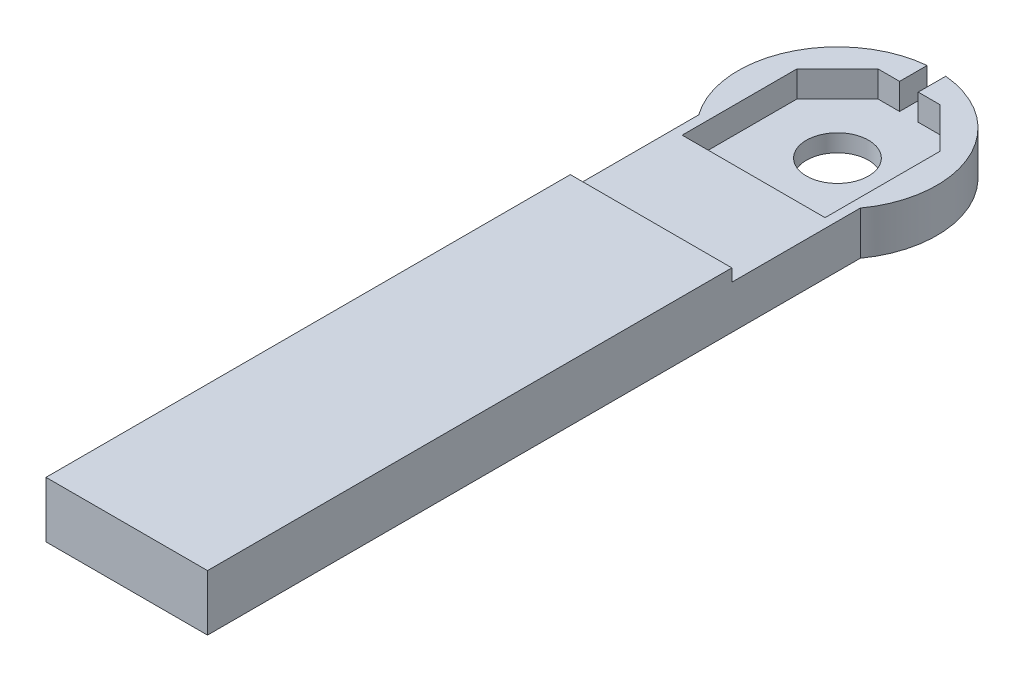
ISO-10303-21;
HEADER;
FILE_DESCRIPTION(('STEP AP214'),'2;1');
FILE_NAME('part.step','',(''),(''),'','','');
FILE_SCHEMA(('AUTOMOTIVE_DESIGN { 1 0 10303 214 1 1 1 1 }'));
ENDSEC;
DATA;
#1=APPLICATION_CONTEXT('core data for automotive mechanical design processes');
#2=APPLICATION_PROTOCOL_DEFINITION('international standard','automotive_design',2000,#1);
#3=PRODUCT_CONTEXT('',#1,'mechanical');
#4=PRODUCT('Part','Part','',(#3));
#5=PRODUCT_RELATED_PRODUCT_CATEGORY('part','',(#4));
#6=PRODUCT_DEFINITION_FORMATION('','',#4);
#7=PRODUCT_DEFINITION_CONTEXT('part definition',#1,'design');
#8=PRODUCT_DEFINITION('design','',#6,#7);
#9=PRODUCT_DEFINITION_SHAPE('','',#8);
#10=(LENGTH_UNIT() NAMED_UNIT(*) SI_UNIT(.MILLI.,.METRE.));
#11=(NAMED_UNIT(*) PLANE_ANGLE_UNIT() SI_UNIT($,.RADIAN.));
#12=(NAMED_UNIT(*) SI_UNIT($,.STERADIAN.) SOLID_ANGLE_UNIT());
#13=UNCERTAINTY_MEASURE_WITH_UNIT(LENGTH_MEASURE(1.E-05),#10,'distance_accuracy_value','');
#14=(GEOMETRIC_REPRESENTATION_CONTEXT(3) GLOBAL_UNCERTAINTY_ASSIGNED_CONTEXT((#13)) GLOBAL_UNIT_ASSIGNED_CONTEXT((#10,
#11,#12)) REPRESENTATION_CONTEXT('',''));
#15=CARTESIAN_POINT('',(0.,0.,0.));
#16=DIRECTION('',(0.,0.,1.));
#17=DIRECTION('',(1.,0.,0.));
#18=AXIS2_PLACEMENT_3D('',#15,#16,#17);
#19=CARTESIAN_POINT('',(6.5,2.1,0.));
#20=DIRECTION('',(-1.,0.,0.));
#21=DIRECTION('',(0.,0.,1.));
#22=AXIS2_PLACEMENT_3D('',#19,#20,#21);
#23=PLANE('',#22);
#24=DIRECTION('',(0.,0.,-1.));
#25=VECTOR('',#24,1.);
#26=CARTESIAN_POINT('',(6.5,2.1,0.));
#27=LINE('',#26,#25);
#28=CARTESIAN_POINT('',(6.5,2.1,15.));
#29=VERTEX_POINT('',#28);
#30=CARTESIAN_POINT('',(6.5,2.1,4.66368952654441));
#31=VERTEX_POINT('',#30);
#32=EDGE_CURVE('E306',#29,#31,#27,.T.);
#33=ORIENTED_EDGE('',*,*,#32,.F.);
#34=DIRECTION('',(0.,1.,0.));
#35=VECTOR('',#34,1.);
#36=CARTESIAN_POINT('',(6.5,-1.4,15.));
#37=LINE('',#36,#35);
#38=CARTESIAN_POINT('',(6.5,3.1,15.));
#39=VERTEX_POINT('',#38);
#40=EDGE_CURVE('E203',#29,#39,#37,.T.);
#41=ORIENTED_EDGE('',*,*,#40,.T.);
#42=DIRECTION('',(0.,0.,-1.));
#43=VECTOR('',#42,1.);
#44=CARTESIAN_POINT('',(6.5,3.1,70.9568164921976));
#45=LINE('',#44,#43);
#46=CARTESIAN_POINT('',(6.5,3.1,57.2));
#47=VERTEX_POINT('',#46);
#48=EDGE_CURVE('E196',#47,#39,#45,.T.);
#49=ORIENTED_EDGE('',*,*,#48,.F.);
#50=DIRECTION('',(0.,1.,0.));
#51=VECTOR('',#50,1.);
#52=CARTESIAN_POINT('',(6.5,-1.4,57.2));
#53=LINE('',#52,#51);
#54=CARTESIAN_POINT('',(6.5,-1.4,57.2));
#55=VERTEX_POINT('',#54);
#56=EDGE_CURVE('E201',#55,#47,#53,.T.);
#57=ORIENTED_EDGE('',*,*,#56,.F.);
#58=DIRECTION('',(0.,0.,-1.));
#59=VECTOR('',#58,1.);
#60=CARTESIAN_POINT('',(6.5,-1.4,4.66368952654441));
#61=LINE('',#60,#59);
#62=CARTESIAN_POINT('',(6.5,-1.4,4.66368952654441));
#63=VERTEX_POINT('',#62);
#64=EDGE_CURVE('E301',#55,#63,#61,.T.);
#65=ORIENTED_EDGE('',*,*,#64,.T.);
#66=DIRECTION('',(0.,-1.,0.));
#67=VECTOR('',#66,1.);
#68=CARTESIAN_POINT('',(6.5,2.1,4.66368952654441));
#69=LINE('',#68,#67);
#70=EDGE_CURVE('E11',#31,#63,#69,.T.);
#71=ORIENTED_EDGE('',*,*,#70,.F.);
#72=EDGE_LOOP('',(#33,#41,#49,#57,#65,#71));
#73=FACE_BOUND('',#72,.T.);
#74=ADVANCED_FACE('F36',(#73),#23,.F.);
#75=CARTESIAN_POINT('',(0.75,2.1,0.));
#76=DIRECTION('',(-1.,0.,0.));
#77=DIRECTION('',(0.,0.,1.));
#78=AXIS2_PLACEMENT_3D('',#75,#76,#77);
#79=PLANE('',#78);
#80=DIRECTION('',(0.,0.,-1.));
#81=VECTOR('',#80,1.);
#82=CARTESIAN_POINT('',(0.75,0.,0.));
#83=LINE('',#82,#81);
#84=CARTESIAN_POINT('',(0.75,0.,-5.75));
#85=VERTEX_POINT('',#84);
#86=CARTESIAN_POINT('',(0.75,0.,-7.964766161037));
#87=VERTEX_POINT('',#86);
#88=EDGE_CURVE('E303',#85,#87,#83,.T.);
#89=ORIENTED_EDGE('',*,*,#88,.F.);
#90=DIRECTION('',(0.,-1.,0.));
#91=VECTOR('',#90,1.);
#92=CARTESIAN_POINT('',(0.75,2.1,-5.75));
#93=LINE('',#92,#91);
#94=CARTESIAN_POINT('',(0.75,2.1,-5.75));
#95=VERTEX_POINT('',#94);
#96=EDGE_CURVE('E383',#95,#85,#93,.T.);
#97=ORIENTED_EDGE('',*,*,#96,.F.);
#98=DIRECTION('',(0.,0.,-1.));
#99=VECTOR('',#98,1.);
#100=CARTESIAN_POINT('',(0.75,2.1,0.));
#101=LINE('',#100,#99);
#102=CARTESIAN_POINT('',(0.75,2.1,-7.964766161037));
#103=VERTEX_POINT('',#102);
#104=EDGE_CURVE('E312',#95,#103,#101,.T.);
#105=ORIENTED_EDGE('',*,*,#104,.T.);
#106=DIRECTION('',(0.,-1.,0.));
#107=VECTOR('',#106,1.);
#108=CARTESIAN_POINT('',(0.75,2.1,-7.964766161037));
#109=LINE('',#108,#107);
#110=EDGE_CURVE('E43',#103,#87,#109,.T.);
#111=ORIENTED_EDGE('',*,*,#110,.T.);
#112=EDGE_LOOP('',(#89,#97,#105,#111));
#113=FACE_BOUND('',#112,.T.);
#114=ADVANCED_FACE('F387',(#113),#79,.T.);
#115=CARTESIAN_POINT('',(0.,2.1,-5.75));
#116=DIRECTION('',(0.,0.,-1.));
#117=DIRECTION('',(-1.,0.,0.));
#118=AXIS2_PLACEMENT_3D('',#115,#116,#117);
#119=PLANE('',#118);
#120=DIRECTION('',(1.,0.,0.));
#121=VECTOR('',#120,1.);
#122=CARTESIAN_POINT('',(0.,0.,-5.75));
#123=LINE('',#122,#121);
#124=CARTESIAN_POINT('',(2.5,0.,-5.75));
#125=VERTEX_POINT('',#124);
#126=EDGE_CURVE('E344',#85,#125,#123,.T.);
#127=ORIENTED_EDGE('',*,*,#126,.T.);
#128=DIRECTION('',(0.,-1.,0.));
#129=VECTOR('',#128,1.);
#130=CARTESIAN_POINT('',(2.5,2.1,-5.75));
#131=LINE('',#130,#129);
#132=CARTESIAN_POINT('',(2.5,2.1,-5.75));
#133=VERTEX_POINT('',#132);
#134=EDGE_CURVE('E380',#133,#125,#131,.T.);
#135=ORIENTED_EDGE('',*,*,#134,.F.);
#136=DIRECTION('',(1.,0.,0.));
#137=VECTOR('',#136,1.);
#138=CARTESIAN_POINT('',(0.,2.1,-5.75));
#139=LINE('',#138,#137);
#140=EDGE_CURVE('E316',#95,#133,#139,.T.);
#141=ORIENTED_EDGE('',*,*,#140,.F.);
#142=ORIENTED_EDGE('',*,*,#96,.T.);
#143=EDGE_LOOP('',(#127,#135,#141,#142));
#144=FACE_BOUND('',#143,.T.);
#145=ADVANCED_FACE('F460',(#144),#119,.F.);
#146=CARTESIAN_POINT('',(4.12499999999926,2.1,-4.12500000000171));
#147=DIRECTION('',(0.707106781186337,0.,-0.707106781186758));
#148=DIRECTION('',(-0.707106781186758,0.,-0.707106781186337));
#149=AXIS2_PLACEMENT_3D('',#146,#147,#148);
#150=PLANE('',#149);
#151=DIRECTION('',(0.707106781186758,0.,0.707106781186337));
#152=VECTOR('',#151,1.);
#153=CARTESIAN_POINT('',(4.12499999999926,0.,-4.12500000000171));
#154=LINE('',#153,#152);
#155=CARTESIAN_POINT('',(5.75000000000307,0.,-2.49999999999886));
#156=VERTEX_POINT('',#155);
#157=EDGE_CURVE('E346',#125,#156,#154,.T.);
#158=ORIENTED_EDGE('',*,*,#157,.T.);
#159=DIRECTION('',(0.,-1.,0.));
#160=VECTOR('',#159,1.);
#161=CARTESIAN_POINT('',(5.75000000000307,2.1,-2.49999999999886));
#162=LINE('',#161,#160);
#163=CARTESIAN_POINT('',(5.75000000000307,2.1,-2.49999999999886));
#164=VERTEX_POINT('',#163);
#165=EDGE_CURVE('E378',#164,#156,#162,.T.);
#166=ORIENTED_EDGE('',*,*,#165,.F.);
#167=DIRECTION('',(0.707106781186758,0.,0.707106781186337));
#168=VECTOR('',#167,1.);
#169=CARTESIAN_POINT('',(4.12499999999926,2.1,-4.12500000000171));
#170=LINE('',#169,#168);
#171=EDGE_CURVE('E318',#133,#164,#170,.T.);
#172=ORIENTED_EDGE('',*,*,#171,.F.);
#173=ORIENTED_EDGE('',*,*,#134,.T.);
#174=EDGE_LOOP('',(#158,#166,#172,#173));
#175=FACE_BOUND('',#174,.T.);
#176=ADVANCED_FACE('F464',(#175),#150,.F.);
#177=CARTESIAN_POINT('',(5.75000000000307,2.1,0.));
#178=DIRECTION('',(-1.,0.,0.));
#179=DIRECTION('',(0.,0.,1.));
#180=AXIS2_PLACEMENT_3D('',#177,#178,#179);
#181=PLANE('',#180);
#182=DIRECTION('',(0.,0.,-1.));
#183=VECTOR('',#182,1.);
#184=CARTESIAN_POINT('',(5.75000000000307,0.,0.));
#185=LINE('',#184,#183);
#186=CARTESIAN_POINT('',(5.75000000000307,0.,6.75000000000546));
#187=VERTEX_POINT('',#186);
#188=EDGE_CURVE('E349',#187,#156,#185,.T.);
#189=ORIENTED_EDGE('',*,*,#188,.F.);
#190=DIRECTION('',(0.,-1.,0.));
#191=VECTOR('',#190,1.);
#192=CARTESIAN_POINT('',(5.75000000000307,2.1,6.75000000000546));
#193=LINE('',#192,#191);
#194=CARTESIAN_POINT('',(5.75000000000307,2.1,6.75000000000546));
#195=VERTEX_POINT('',#194);
#196=EDGE_CURVE('E376',#195,#187,#193,.T.);
#197=ORIENTED_EDGE('',*,*,#196,.F.);
#198=DIRECTION('',(0.,0.,-1.));
#199=VECTOR('',#198,1.);
#200=CARTESIAN_POINT('',(5.75000000000307,2.1,0.));
#201=LINE('',#200,#199);
#202=EDGE_CURVE('E320',#195,#164,#201,.T.);
#203=ORIENTED_EDGE('',*,*,#202,.T.);
#204=ORIENTED_EDGE('',*,*,#165,.T.);
#205=EDGE_LOOP('',(#189,#197,#203,#204));
#206=FACE_BOUND('',#205,.T.);
#207=ADVANCED_FACE('F470',(#206),#181,.T.);
#208=CARTESIAN_POINT('',(0.,2.1,6.75000000000546));
#209=DIRECTION('',(0.,0.,-1.));
#210=DIRECTION('',(-1.,0.,0.));
#211=AXIS2_PLACEMENT_3D('',#208,#209,#210);
#212=PLANE('',#211);
#213=DIRECTION('',(1.,0.,0.));
#214=VECTOR('',#213,1.);
#215=CARTESIAN_POINT('',(0.,0.,6.75000000000546));
#216=LINE('',#215,#214);
#217=CARTESIAN_POINT('',(-5.75000000000307,0.,6.75000000000546));
#218=VERTEX_POINT('',#217);
#219=CARTESIAN_POINT('',(-5.,0.,6.75000000000546));
#220=VERTEX_POINT('',#219);
#221=EDGE_CURVE('E352',#218,#220,#216,.T.);
#222=ORIENTED_EDGE('',*,*,#221,.F.);
#223=DIRECTION('',(0.,-1.,0.));
#224=VECTOR('',#223,1.);
#225=CARTESIAN_POINT('',(-5.75000000000307,2.1,6.75000000000546));
#226=LINE('',#225,#224);
#227=CARTESIAN_POINT('',(-5.75000000000307,2.1,6.75000000000546));
#228=VERTEX_POINT('',#227);
#229=EDGE_CURVE('E374',#228,#218,#226,.T.);
#230=ORIENTED_EDGE('',*,*,#229,.F.);
#231=DIRECTION('',(1.,0.,0.));
#232=VECTOR('',#231,1.);
#233=CARTESIAN_POINT('',(0.,2.1,6.75000000000546));
#234=LINE('',#233,#232);
#235=EDGE_CURVE('E323',#228,#195,#234,.T.);
#236=ORIENTED_EDGE('',*,*,#235,.T.);
#237=ORIENTED_EDGE('',*,*,#196,.T.);
#238=CARTESIAN_POINT('',(5.00000000000307,0.,6.75000000000546));
#239=VERTEX_POINT('',#238);
#240=EDGE_CURVE('E50',#239,#187,#216,.T.);
#241=ORIENTED_EDGE('',*,*,#240,.F.);
#242=DIRECTION('',(0.,1.,0.));
#243=VECTOR('',#242,1.);
#244=CARTESIAN_POINT('',(5.00000000000307,-1.4,6.75000000000546));
#245=LINE('',#244,#243);
#246=CARTESIAN_POINT('',(5.00000000000307,-1.4,6.75000000000546));
#247=VERTEX_POINT('',#246);
#248=EDGE_CURVE('E253',#247,#239,#245,.T.);
#249=ORIENTED_EDGE('',*,*,#248,.F.);
#250=DIRECTION('',(1.,0.,0.));
#251=VECTOR('',#250,1.);
#252=CARTESIAN_POINT('',(3.50000000000307,-1.4,6.75000000000546));
#253=LINE('',#252,#251);
#254=CARTESIAN_POINT('',(3.50000000000307,-1.4,6.75000000000546));
#255=VERTEX_POINT('',#254);
#256=EDGE_CURVE('E239',#255,#247,#253,.T.);
#257=ORIENTED_EDGE('',*,*,#256,.F.);
#258=DIRECTION('',(0.,1.,0.));
#259=VECTOR('',#258,1.);
#260=CARTESIAN_POINT('',(3.50000000000307,-1.4,6.75000000000546));
#261=LINE('',#260,#259);
#262=CARTESIAN_POINT('',(3.50000000000307,0.,6.75000000000546));
#263=VERTEX_POINT('',#262);
#264=EDGE_CURVE('E255',#255,#263,#261,.T.);
#265=ORIENTED_EDGE('',*,*,#264,.T.);
#266=CARTESIAN_POINT('',(-3.5,0.,6.75000000000546));
#267=VERTEX_POINT('',#266);
#268=EDGE_CURVE('E58',#267,#263,#216,.T.);
#269=ORIENTED_EDGE('',*,*,#268,.F.);
#270=DIRECTION('',(0.,1.,0.));
#271=VECTOR('',#270,1.);
#272=CARTESIAN_POINT('',(-3.5,-1.4,6.75000000000546));
#273=LINE('',#272,#271);
#274=CARTESIAN_POINT('',(-3.5,-1.4,6.75000000000546));
#275=VERTEX_POINT('',#274);
#276=EDGE_CURVE('E282',#275,#267,#273,.T.);
#277=ORIENTED_EDGE('',*,*,#276,.F.);
#278=DIRECTION('',(1.,0.,0.));
#279=VECTOR('',#278,1.);
#280=CARTESIAN_POINT('',(-5.,-1.4,6.75000000000546));
#281=LINE('',#280,#279);
#282=CARTESIAN_POINT('',(-5.,-1.4,6.75000000000546));
#283=VERTEX_POINT('',#282);
#284=EDGE_CURVE('E266',#283,#275,#281,.T.);
#285=ORIENTED_EDGE('',*,*,#284,.F.);
#286=DIRECTION('',(0.,1.,0.));
#287=VECTOR('',#286,1.);
#288=CARTESIAN_POINT('',(-5.,-1.4,6.75000000000546));
#289=LINE('',#288,#287);
#290=EDGE_CURVE('E285',#283,#220,#289,.T.);
#291=ORIENTED_EDGE('',*,*,#290,.T.);
#292=EDGE_LOOP('',(#222,#230,#236,#237,#241,#249,#257,#265,#269,#277,#285,#291));
#293=FACE_BOUND('',#292,.T.);
#294=ADVANCED_FACE('F420',(#293),#212,.T.);
#295=CARTESIAN_POINT('',(-5.75000000000083,2.1,-1.90812549694622E-12));
#296=DIRECTION('',(1.,0.,3.31847912512338E-13));
#297=DIRECTION('',(3.31847912512338E-13,0.,-1.));
#298=AXIS2_PLACEMENT_3D('',#295,#296,#297);
#299=PLANE('',#298);
#300=DIRECTION('',(-3.31847912512338E-13,0.,1.));
#301=VECTOR('',#300,1.);
#302=CARTESIAN_POINT('',(-5.75000000000083,0.,-1.90812549694622E-12));
#303=LINE('',#302,#301);
#304=CARTESIAN_POINT('',(-5.75,0.,-2.50000000000006));
#305=VERTEX_POINT('',#304);
#306=EDGE_CURVE('E354',#305,#218,#303,.T.);
#307=ORIENTED_EDGE('',*,*,#306,.F.);
#308=DIRECTION('',(0.,-1.,0.));
#309=VECTOR('',#308,1.);
#310=CARTESIAN_POINT('',(-5.75,2.1,-2.50000000000006));
#311=LINE('',#310,#309);
#312=CARTESIAN_POINT('',(-5.75,2.1,-2.50000000000006));
#313=VERTEX_POINT('',#312);
#314=EDGE_CURVE('E372',#313,#305,#311,.T.);
#315=ORIENTED_EDGE('',*,*,#314,.F.);
#316=DIRECTION('',(-3.31847912512338E-13,0.,1.));
#317=VECTOR('',#316,1.);
#318=CARTESIAN_POINT('',(-5.75000000000083,2.1,-1.90812549694622E-12));
#319=LINE('',#318,#317);
#320=EDGE_CURVE('E326',#313,#228,#319,.T.);
#321=ORIENTED_EDGE('',*,*,#320,.T.);
#322=ORIENTED_EDGE('',*,*,#229,.T.);
#323=EDGE_LOOP('',(#307,#315,#321,#322));
#324=FACE_BOUND('',#323,.T.);
#325=ADVANCED_FACE('F415',(#324),#299,.T.);
#326=CARTESIAN_POINT('',(-4.12499999999998,2.1,-4.12500000000005));
#327=DIRECTION('',(-0.707106781186541,0.,-0.707106781186554));
#328=DIRECTION('',(-0.707106781186554,0.,0.707106781186541));
#329=AXIS2_PLACEMENT_3D('',#326,#327,#328);
#330=PLANE('',#329);
#331=DIRECTION('',(0.707106781186554,0.,-0.707106781186541));
#332=VECTOR('',#331,1.);
#333=CARTESIAN_POINT('',(-4.12499999999998,0.,-4.12500000000005));
#334=LINE('',#333,#332);
#335=CARTESIAN_POINT('',(-2.5,0.,-5.75));
#336=VERTEX_POINT('',#335);
#337=EDGE_CURVE('E357',#305,#336,#334,.T.);
#338=ORIENTED_EDGE('',*,*,#337,.T.);
#339=DIRECTION('',(0.,-1.,0.));
#340=VECTOR('',#339,1.);
#341=CARTESIAN_POINT('',(-2.5,2.1,-5.75));
#342=LINE('',#341,#340);
#343=CARTESIAN_POINT('',(-2.5,2.1,-5.75));
#344=VERTEX_POINT('',#343);
#345=EDGE_CURVE('E369',#344,#336,#342,.T.);
#346=ORIENTED_EDGE('',*,*,#345,.F.);
#347=DIRECTION('',(0.707106781186554,0.,-0.707106781186541));
#348=VECTOR('',#347,1.);
#349=CARTESIAN_POINT('',(-4.12499999999998,2.1,-4.12500000000005));
#350=LINE('',#349,#348);
#351=EDGE_CURVE('E329',#313,#344,#350,.T.);
#352=ORIENTED_EDGE('',*,*,#351,.F.);
#353=ORIENTED_EDGE('',*,*,#314,.T.);
#354=EDGE_LOOP('',(#338,#346,#352,#353));
#355=FACE_BOUND('',#354,.T.);
#356=ADVANCED_FACE('F411',(#355),#330,.F.);
#357=CARTESIAN_POINT('',(0.,2.1,-5.75));
#358=DIRECTION('',(0.,0.,-1.));
#359=DIRECTION('',(-1.,0.,0.));
#360=AXIS2_PLACEMENT_3D('',#357,#358,#359);
#361=PLANE('',#360);
#362=DIRECTION('',(1.,0.,0.));
#363=VECTOR('',#362,1.);
#364=CARTESIAN_POINT('',(0.,0.,-5.75));
#365=LINE('',#364,#363);
#366=CARTESIAN_POINT('',(-0.75,0.,-5.75));
#367=VERTEX_POINT('',#366);
#368=EDGE_CURVE('E359',#336,#367,#365,.T.);
#369=ORIENTED_EDGE('',*,*,#368,.T.);
#370=DIRECTION('',(0.,-1.,0.));
#371=VECTOR('',#370,1.);
#372=CARTESIAN_POINT('',(-0.75,2.1,-5.75));
#373=LINE('',#372,#371);
#374=CARTESIAN_POINT('',(-0.75,2.1,-5.75));
#375=VERTEX_POINT('',#374);
#376=EDGE_CURVE('E366',#375,#367,#373,.T.);
#377=ORIENTED_EDGE('',*,*,#376,.F.);
#378=DIRECTION('',(1.,0.,0.));
#379=VECTOR('',#378,1.);
#380=CARTESIAN_POINT('',(0.,2.1,-5.75));
#381=LINE('',#380,#379);
#382=EDGE_CURVE('E331',#344,#375,#381,.T.);
#383=ORIENTED_EDGE('',*,*,#382,.F.);
#384=ORIENTED_EDGE('',*,*,#345,.T.);
#385=EDGE_LOOP('',(#369,#377,#383,#384));
#386=FACE_BOUND('',#385,.T.);
#387=ADVANCED_FACE('F406',(#386),#361,.F.);
#388=CARTESIAN_POINT('',(-0.75,2.1,0.));
#389=DIRECTION('',(-1.,0.,0.));
#390=DIRECTION('',(0.,0.,1.));
#391=AXIS2_PLACEMENT_3D('',#388,#389,#390);
#392=PLANE('',#391);
#393=DIRECTION('',(0.,0.,-1.));
#394=VECTOR('',#393,1.);
#395=CARTESIAN_POINT('',(-0.75,0.,0.));
#396=LINE('',#395,#394);
#397=CARTESIAN_POINT('',(-0.75,0.,-7.964766161037));
#398=VERTEX_POINT('',#397);
#399=EDGE_CURVE('E310',#367,#398,#396,.T.);
#400=ORIENTED_EDGE('',*,*,#399,.T.);
#401=DIRECTION('',(0.,-1.,0.));
#402=VECTOR('',#401,1.);
#403=CARTESIAN_POINT('',(-0.75,2.1,-7.964766161037));
#404=LINE('',#403,#402);
#405=CARTESIAN_POINT('',(-0.75,2.1,-7.964766161037));
#406=VERTEX_POINT('',#405);
#407=EDGE_CURVE('E363',#406,#398,#404,.T.);
#408=ORIENTED_EDGE('',*,*,#407,.F.);
#409=DIRECTION('',(0.,0.,-1.));
#410=VECTOR('',#409,1.);
#411=CARTESIAN_POINT('',(-0.75,2.1,0.));
#412=LINE('',#411,#410);
#413=EDGE_CURVE('E333',#375,#406,#412,.T.);
#414=ORIENTED_EDGE('',*,*,#413,.F.);
#415=ORIENTED_EDGE('',*,*,#376,.T.);
#416=EDGE_LOOP('',(#400,#408,#414,#415));
#417=FACE_BOUND('',#416,.T.);
#418=ADVANCED_FACE('F401',(#417),#392,.F.);
#419=CARTESIAN_POINT('',(0.,2.1,0.));
#420=DIRECTION('',(0.,-1.,0.));
#421=DIRECTION('',(0.,0.,-1.));
#422=AXIS2_PLACEMENT_3D('',#419,#420,#421);
#423=CYLINDRICAL_SURFACE('',#422,8.);
#424=ORIENTED_EDGE('',*,*,#407,.T.);
#425=CARTESIAN_POINT('',(0.,0.,0.));
#426=DIRECTION('',(0.,1.,0.));
#427=DIRECTION('',(0.,0.,1.));
#428=AXIS2_PLACEMENT_3D('',#425,#426,#427);
#429=CIRCLE('',#428,8.);
#430=EDGE_CURVE('E293',#87,#398,#429,.T.);
#431=ORIENTED_EDGE('',*,*,#430,.F.);
#432=ORIENTED_EDGE('',*,*,#110,.F.);
#433=CARTESIAN_POINT('',(0.,2.1,0.));
#434=DIRECTION('',(0.,1.,0.));
#435=DIRECTION('',(0.,0.,1.));
#436=AXIS2_PLACEMENT_3D('',#433,#434,#435);
#437=CIRCLE('',#436,8.);
#438=EDGE_CURVE('E309',#31,#103,#437,.T.);
#439=ORIENTED_EDGE('',*,*,#438,.F.);
#440=ORIENTED_EDGE('',*,*,#70,.T.);
#441=CARTESIAN_POINT('',(0.,-1.4,0.));
#442=DIRECTION('',(0.,1.,0.));
#443=DIRECTION('',(0.,0.,1.));
#444=AXIS2_PLACEMENT_3D('',#441,#442,#443);
#445=CIRCLE('',#444,8.);
#446=CARTESIAN_POINT('',(-6.5,-1.4,4.66368952654441));
#447=VERTEX_POINT('',#446);
#448=EDGE_CURVE('E296',#63,#447,#445,.T.);
#449=ORIENTED_EDGE('',*,*,#448,.T.);
#450=DIRECTION('',(0.,-1.,0.));
#451=VECTOR('',#450,1.);
#452=CARTESIAN_POINT('',(-6.5,2.1,4.66368952654441));
#453=LINE('',#452,#451);
#454=CARTESIAN_POINT('',(-6.5,2.1,4.66368952654441));
#455=VERTEX_POINT('',#454);
#456=EDGE_CURVE('E341',#455,#447,#453,.T.);
#457=ORIENTED_EDGE('',*,*,#456,.F.);
#458=EDGE_CURVE('E313',#406,#455,#437,.T.);
#459=ORIENTED_EDGE('',*,*,#458,.F.);
#460=EDGE_LOOP('',(#424,#431,#432,#439,#440,#449,#457,#459));
#461=FACE_BOUND('',#460,.T.);
#462=ADVANCED_FACE('F395',(#461),#423,.T.);
#463=CARTESIAN_POINT('',(-6.5,2.1,0.));
#464=DIRECTION('',(1.,0.,0.));
#465=DIRECTION('',(0.,0.,-1.));
#466=AXIS2_PLACEMENT_3D('',#463,#464,#465);
#467=PLANE('',#466);
#468=ORIENTED_EDGE('',*,*,#456,.T.);
#469=DIRECTION('',(0.,0.,1.));
#470=VECTOR('',#469,1.);
#471=CARTESIAN_POINT('',(-6.5,-1.4,15.));
#472=LINE('',#471,#470);
#473=CARTESIAN_POINT('',(-6.5,-1.4,57.2));
#474=VERTEX_POINT('',#473);
#475=EDGE_CURVE('E299',#447,#474,#472,.T.);
#476=ORIENTED_EDGE('',*,*,#475,.T.);
#477=DIRECTION('',(0.,-1.,0.));
#478=VECTOR('',#477,1.);
#479=CARTESIAN_POINT('',(-6.5,-1.4,57.2));
#480=LINE('',#479,#478);
#481=CARTESIAN_POINT('',(-6.5,3.1,57.2));
#482=VERTEX_POINT('',#481);
#483=EDGE_CURVE('E216',#482,#474,#480,.T.);
#484=ORIENTED_EDGE('',*,*,#483,.F.);
#485=DIRECTION('',(0.,0.,-1.));
#486=VECTOR('',#485,1.);
#487=CARTESIAN_POINT('',(-6.5,3.1,70.9568164921976));
#488=LINE('',#487,#486);
#489=CARTESIAN_POINT('',(-6.5,3.1,15.));
#490=VERTEX_POINT('',#489);
#491=EDGE_CURVE('E212',#482,#490,#488,.T.);
#492=ORIENTED_EDGE('',*,*,#491,.T.);
#493=DIRECTION('',(0.,-1.,0.));
#494=VECTOR('',#493,1.);
#495=CARTESIAN_POINT('',(-6.5,-1.4,15.));
#496=LINE('',#495,#494);
#497=CARTESIAN_POINT('',(-6.5,2.1,15.));
#498=VERTEX_POINT('',#497);
#499=EDGE_CURVE('E227',#490,#498,#496,.T.);
#500=ORIENTED_EDGE('',*,*,#499,.T.);
#501=DIRECTION('',(0.,0.,1.));
#502=VECTOR('',#501,1.);
#503=CARTESIAN_POINT('',(-6.5,2.1,0.));
#504=LINE('',#503,#502);
#505=EDGE_CURVE('E335',#455,#498,#504,.T.);
#506=ORIENTED_EDGE('',*,*,#505,.F.);
#507=EDGE_LOOP('',(#468,#476,#484,#492,#500,#506));
#508=FACE_BOUND('',#507,.T.);
#509=ADVANCED_FACE('F487',(#508),#467,.F.);
#510=CARTESIAN_POINT('',(0.,2.1,0.));
#511=DIRECTION('',(0.,1.,0.));
#512=DIRECTION('',(0.,0.,1.));
#513=AXIS2_PLACEMENT_3D('',#510,#511,#512);
#514=PLANE('',#513);
#515=ORIENTED_EDGE('',*,*,#32,.T.);
#516=ORIENTED_EDGE('',*,*,#438,.T.);
#517=ORIENTED_EDGE('',*,*,#104,.F.);
#518=ORIENTED_EDGE('',*,*,#140,.T.);
#519=ORIENTED_EDGE('',*,*,#171,.T.);
#520=ORIENTED_EDGE('',*,*,#202,.F.);
#521=ORIENTED_EDGE('',*,*,#235,.F.);
#522=ORIENTED_EDGE('',*,*,#320,.F.);
#523=ORIENTED_EDGE('',*,*,#351,.T.);
#524=ORIENTED_EDGE('',*,*,#382,.T.);
#525=ORIENTED_EDGE('',*,*,#413,.T.);
#526=ORIENTED_EDGE('',*,*,#458,.T.);
#527=ORIENTED_EDGE('',*,*,#505,.T.);
#528=DIRECTION('',(1.,0.,0.));
#529=VECTOR('',#528,1.);
#530=CARTESIAN_POINT('',(0.,2.1,15.));
#531=LINE('',#530,#529);
#532=EDGE_CURVE('E338',#498,#29,#531,.T.);
#533=ORIENTED_EDGE('',*,*,#532,.T.);
#534=EDGE_LOOP('',(#515,#516,#517,#518,#519,#520,#521,#522,#523,#524,#525,#526,#527,#533));
#535=FACE_BOUND('',#534,.T.);
#536=ADVANCED_FACE('F490',(#535),#514,.T.);
#537=CARTESIAN_POINT('',(0.,0.,0.));
#538=DIRECTION('',(0.,1.,0.));
#539=DIRECTION('',(0.,0.,1.));
#540=AXIS2_PLACEMENT_3D('',#537,#538,#539);
#541=PLANE('',#540);
#542=CARTESIAN_POINT('',(0.,0.,0.));
#543=DIRECTION('',(0.,1.,0.));
#544=DIRECTION('',(0.,0.,1.));
#545=AXIS2_PLACEMENT_3D('',#542,#543,#544);
#546=CIRCLE('',#545,2.5);
#547=CARTESIAN_POINT('',(0.,0.,2.5));
#548=VERTEX_POINT('',#547);
#549=EDGE_CURVE('E281',#548,#548,#546,.T.);
#550=ORIENTED_EDGE('',*,*,#549,.F.);
#551=EDGE_LOOP('',(#550));
#552=FACE_BOUND('',#551,.T.);
#553=ORIENTED_EDGE('',*,*,#399,.F.);
#554=ORIENTED_EDGE('',*,*,#368,.F.);
#555=ORIENTED_EDGE('',*,*,#337,.F.);
#556=ORIENTED_EDGE('',*,*,#306,.T.);
#557=ORIENTED_EDGE('',*,*,#221,.T.);
#558=DIRECTION('',(0.,0.,1.));
#559=VECTOR('',#558,1.);
#560=CARTESIAN_POINT('',(-5.,0.,5.50000000000546));
#561=LINE('',#560,#559);
#562=CARTESIAN_POINT('',(-5.,0.,5.50000000000546));
#563=VERTEX_POINT('',#562);
#564=EDGE_CURVE('E274',#563,#220,#561,.T.);
#565=ORIENTED_EDGE('',*,*,#564,.F.);
#566=CARTESIAN_POINT('',(-4.25,0.,5.50000000000546));
#567=DIRECTION('',(0.,1.,0.));
#568=DIRECTION('',(0.,0.,1.));
#569=AXIS2_PLACEMENT_3D('',#566,#567,#568);
#570=CIRCLE('',#569,0.75);
#571=CARTESIAN_POINT('',(-3.5,0.,5.50000000000546));
#572=VERTEX_POINT('',#571);
#573=EDGE_CURVE('E252',#572,#563,#570,.T.);
#574=ORIENTED_EDGE('',*,*,#573,.F.);
#575=DIRECTION('',(0.,0.,-1.));
#576=VECTOR('',#575,1.);
#577=CARTESIAN_POINT('',(-3.5,0.,6.75000000000546));
#578=LINE('',#577,#576);
#579=EDGE_CURVE('E263',#267,#572,#578,.T.);
#580=ORIENTED_EDGE('',*,*,#579,.F.);
#581=ORIENTED_EDGE('',*,*,#268,.T.);
#582=DIRECTION('',(0.,0.,1.));
#583=VECTOR('',#582,1.);
#584=CARTESIAN_POINT('',(3.50000000000307,0.,5.50000000000546));
#585=LINE('',#584,#583);
#586=CARTESIAN_POINT('',(3.50000000000307,0.,5.50000000000546));
#587=VERTEX_POINT('',#586);
#588=EDGE_CURVE('E223',#587,#263,#585,.T.);
#589=ORIENTED_EDGE('',*,*,#588,.F.);
#590=CARTESIAN_POINT('',(4.25000000000307,0.,5.50000000000546));
#591=DIRECTION('',(0.,1.,0.));
#592=DIRECTION('',(0.,0.,1.));
#593=AXIS2_PLACEMENT_3D('',#590,#591,#592);
#594=CIRCLE('',#593,0.75);
#595=CARTESIAN_POINT('',(5.00000000000307,0.,5.50000000000546));
#596=VERTEX_POINT('',#595);
#597=EDGE_CURVE('E221',#596,#587,#594,.T.);
#598=ORIENTED_EDGE('',*,*,#597,.F.);
#599=DIRECTION('',(0.,0.,-1.));
#600=VECTOR('',#599,1.);
#601=CARTESIAN_POINT('',(5.00000000000307,0.,6.75000000000546));
#602=LINE('',#601,#600);
#603=EDGE_CURVE('E236',#239,#596,#602,.T.);
#604=ORIENTED_EDGE('',*,*,#603,.F.);
#605=ORIENTED_EDGE('',*,*,#240,.T.);
#606=ORIENTED_EDGE('',*,*,#188,.T.);
#607=ORIENTED_EDGE('',*,*,#157,.F.);
#608=ORIENTED_EDGE('',*,*,#126,.F.);
#609=ORIENTED_EDGE('',*,*,#88,.T.);
#610=ORIENTED_EDGE('',*,*,#430,.T.);
#611=EDGE_LOOP('',(#553,#554,#555,#556,#557,#565,#574,#580,#581,#589,#598,#604,#605,#606,#607,
#608,#609,#610));
#612=FACE_BOUND('',#611,.T.);
#613=ADVANCED_FACE('F393',(#552,#612),#541,.T.);
#614=CARTESIAN_POINT('',(0.,-1.4,0.));
#615=DIRECTION('',(0.,1.,0.));
#616=DIRECTION('',(0.,0.,1.));
#617=AXIS2_PLACEMENT_3D('',#614,#615,#616);
#618=PLANE('',#617);
#619=DIRECTION('',(0.,0.,-1.));
#620=VECTOR('',#619,1.);
#621=CARTESIAN_POINT('',(5.00000000000307,-1.4,6.75000000000546));
#622=LINE('',#621,#620);
#623=CARTESIAN_POINT('',(5.00000000000307,-1.4,5.50000000000546));
#624=VERTEX_POINT('',#623);
#625=EDGE_CURVE('E242',#247,#624,#622,.T.);
#626=ORIENTED_EDGE('',*,*,#625,.T.);
#627=CARTESIAN_POINT('',(4.25000000000307,-1.4,5.50000000000546));
#628=DIRECTION('',(0.,1.,0.));
#629=DIRECTION('',(0.,0.,1.));
#630=AXIS2_PLACEMENT_3D('',#627,#628,#629);
#631=CIRCLE('',#630,0.75);
#632=CARTESIAN_POINT('',(3.50000000000307,-1.4,5.50000000000546));
#633=VERTEX_POINT('',#632);
#634=EDGE_CURVE('E232',#624,#633,#631,.T.);
#635=ORIENTED_EDGE('',*,*,#634,.T.);
#636=DIRECTION('',(0.,0.,1.));
#637=VECTOR('',#636,1.);
#638=CARTESIAN_POINT('',(3.50000000000307,-1.4,5.50000000000546));
#639=LINE('',#638,#637);
#640=EDGE_CURVE('E235',#633,#255,#639,.T.);
#641=ORIENTED_EDGE('',*,*,#640,.T.);
#642=ORIENTED_EDGE('',*,*,#256,.T.);
#643=EDGE_LOOP('',(#626,#635,#641,#642));
#644=FACE_BOUND('',#643,.T.);
#645=DIRECTION('',(0.,0.,-1.));
#646=VECTOR('',#645,1.);
#647=CARTESIAN_POINT('',(-3.5,-1.4,6.75000000000546));
#648=LINE('',#647,#646);
#649=CARTESIAN_POINT('',(-3.5,-1.4,5.50000000000546));
#650=VERTEX_POINT('',#649);
#651=EDGE_CURVE('E269',#275,#650,#648,.T.);
#652=ORIENTED_EDGE('',*,*,#651,.T.);
#653=CARTESIAN_POINT('',(-4.25,-1.4,5.50000000000546));
#654=DIRECTION('',(0.,1.,0.));
#655=DIRECTION('',(0.,0.,1.));
#656=AXIS2_PLACEMENT_3D('',#653,#654,#655);
#657=CIRCLE('',#656,0.75);
#658=CARTESIAN_POINT('',(-5.,-1.4,5.50000000000546));
#659=VERTEX_POINT('',#658);
#660=EDGE_CURVE('E259',#650,#659,#657,.T.);
#661=ORIENTED_EDGE('',*,*,#660,.T.);
#662=DIRECTION('',(0.,0.,1.));
#663=VECTOR('',#662,1.);
#664=CARTESIAN_POINT('',(-5.,-1.4,5.50000000000546));
#665=LINE('',#664,#663);
#666=EDGE_CURVE('E262',#659,#283,#665,.T.);
#667=ORIENTED_EDGE('',*,*,#666,.T.);
#668=ORIENTED_EDGE('',*,*,#284,.T.);
#669=EDGE_LOOP('',(#652,#661,#667,#668));
#670=FACE_BOUND('',#669,.T.);
#671=CARTESIAN_POINT('',(0.,-1.4,0.));
#672=DIRECTION('',(0.,1.,0.));
#673=DIRECTION('',(0.,0.,1.));
#674=AXIS2_PLACEMENT_3D('',#671,#672,#673);
#675=CIRCLE('',#674,2.5);
#676=CARTESIAN_POINT('',(0.,-1.4,2.5));
#677=VERTEX_POINT('',#676);
#678=EDGE_CURVE('E290',#677,#677,#675,.T.);
#679=ORIENTED_EDGE('',*,*,#678,.T.);
#680=EDGE_LOOP('',(#679));
#681=FACE_BOUND('',#680,.T.);
#682=ORIENTED_EDGE('',*,*,#448,.F.);
#683=ORIENTED_EDGE('',*,*,#64,.F.);
#684=DIRECTION('',(1.,0.,0.));
#685=VECTOR('',#684,1.);
#686=CARTESIAN_POINT('',(-6.5,-1.4,57.2));
#687=LINE('',#686,#685);
#688=EDGE_CURVE('E220',#474,#55,#687,.T.);
#689=ORIENTED_EDGE('',*,*,#688,.F.);
#690=ORIENTED_EDGE('',*,*,#475,.F.);
#691=EDGE_LOOP('',(#682,#683,#689,#690));
#692=FACE_BOUND('',#691,.T.);
#693=ADVANCED_FACE('F442',(#644,#670,#681,#692),#618,.F.);
#694=CARTESIAN_POINT('',(0.,-1.4,0.));
#695=DIRECTION('',(0.,1.,0.));
#696=DIRECTION('',(0.,0.,1.));
#697=AXIS2_PLACEMENT_3D('',#694,#695,#696);
#698=CYLINDRICAL_SURFACE('',#697,2.5);
#699=ORIENTED_EDGE('',*,*,#678,.F.);
#700=EDGE_LOOP('',(#699));
#701=FACE_BOUND('',#700,.T.);
#702=ORIENTED_EDGE('',*,*,#549,.T.);
#703=EDGE_LOOP('',(#702));
#704=FACE_BOUND('',#703,.T.);
#705=ADVANCED_FACE('F500',(#701,#704),#698,.F.);
#706=CARTESIAN_POINT('',(-4.25,-1.4,5.50000000000546));
#707=DIRECTION('',(0.,1.,0.));
#708=DIRECTION('',(0.,0.,1.));
#709=AXIS2_PLACEMENT_3D('',#706,#707,#708);
#710=CYLINDRICAL_SURFACE('',#709,0.75);
#711=ORIENTED_EDGE('',*,*,#573,.T.);
#712=DIRECTION('',(0.,1.,0.));
#713=VECTOR('',#712,1.);
#714=CARTESIAN_POINT('',(-5.,-1.4,5.50000000000546));
#715=LINE('',#714,#713);
#716=EDGE_CURVE('E272',#659,#563,#715,.T.);
#717=ORIENTED_EDGE('',*,*,#716,.F.);
#718=ORIENTED_EDGE('',*,*,#660,.F.);
#719=DIRECTION('',(0.,1.,0.));
#720=VECTOR('',#719,1.);
#721=CARTESIAN_POINT('',(-3.5,-1.4,5.50000000000546));
#722=LINE('',#721,#720);
#723=EDGE_CURVE('E279',#650,#572,#722,.T.);
#724=ORIENTED_EDGE('',*,*,#723,.T.);
#725=EDGE_LOOP('',(#711,#717,#718,#724));
#726=FACE_BOUND('',#725,.T.);
#727=ADVANCED_FACE('F426',(#726),#710,.F.);
#728=CARTESIAN_POINT('',(-3.5,-1.4,6.75000000000546));
#729=DIRECTION('',(1.,0.,0.));
#730=DIRECTION('',(0.,0.,-1.));
#731=AXIS2_PLACEMENT_3D('',#728,#729,#730);
#732=PLANE('',#731);
#733=ORIENTED_EDGE('',*,*,#579,.T.);
#734=ORIENTED_EDGE('',*,*,#723,.F.);
#735=ORIENTED_EDGE('',*,*,#651,.F.);
#736=ORIENTED_EDGE('',*,*,#276,.T.);
#737=EDGE_LOOP('',(#733,#734,#735,#736));
#738=FACE_BOUND('',#737,.T.);
#739=ADVANCED_FACE('F428',(#738),#732,.F.);
#740=CARTESIAN_POINT('',(-5.,-1.4,5.50000000000546));
#741=DIRECTION('',(-1.,0.,0.));
#742=DIRECTION('',(0.,0.,1.));
#743=AXIS2_PLACEMENT_3D('',#740,#741,#742);
#744=PLANE('',#743);
#745=ORIENTED_EDGE('',*,*,#564,.T.);
#746=ORIENTED_EDGE('',*,*,#290,.F.);
#747=ORIENTED_EDGE('',*,*,#666,.F.);
#748=ORIENTED_EDGE('',*,*,#716,.T.);
#749=EDGE_LOOP('',(#745,#746,#747,#748));
#750=FACE_BOUND('',#749,.T.);
#751=ADVANCED_FACE('F423',(#750),#744,.F.);
#752=CARTESIAN_POINT('',(4.25000000000307,-1.4,5.50000000000546));
#753=DIRECTION('',(0.,1.,0.));
#754=DIRECTION('',(0.,0.,1.));
#755=AXIS2_PLACEMENT_3D('',#752,#753,#754);
#756=CYLINDRICAL_SURFACE('',#755,0.75);
#757=ORIENTED_EDGE('',*,*,#597,.T.);
#758=DIRECTION('',(0.,1.,0.));
#759=VECTOR('',#758,1.);
#760=CARTESIAN_POINT('',(3.50000000000307,-1.4,5.50000000000546));
#761=LINE('',#760,#759);
#762=EDGE_CURVE('E244',#633,#587,#761,.T.);
#763=ORIENTED_EDGE('',*,*,#762,.F.);
#764=ORIENTED_EDGE('',*,*,#634,.F.);
#765=DIRECTION('',(0.,1.,0.));
#766=VECTOR('',#765,1.);
#767=CARTESIAN_POINT('',(5.00000000000307,-1.4,5.50000000000546));
#768=LINE('',#767,#766);
#769=EDGE_CURVE('E250',#624,#596,#768,.T.);
#770=ORIENTED_EDGE('',*,*,#769,.T.);
#771=EDGE_LOOP('',(#757,#763,#764,#770));
#772=FACE_BOUND('',#771,.T.);
#773=ADVANCED_FACE('F445',(#772),#756,.F.);
#774=CARTESIAN_POINT('',(5.00000000000307,-1.4,6.75000000000546));
#775=DIRECTION('',(1.,0.,0.));
#776=DIRECTION('',(0.,0.,-1.));
#777=AXIS2_PLACEMENT_3D('',#774,#775,#776);
#778=PLANE('',#777);
#779=ORIENTED_EDGE('',*,*,#603,.T.);
#780=ORIENTED_EDGE('',*,*,#769,.F.);
#781=ORIENTED_EDGE('',*,*,#625,.F.);
#782=ORIENTED_EDGE('',*,*,#248,.T.);
#783=EDGE_LOOP('',(#779,#780,#781,#782));
#784=FACE_BOUND('',#783,.T.);
#785=ADVANCED_FACE('F435',(#784),#778,.F.);
#786=CARTESIAN_POINT('',(3.50000000000307,-1.4,5.50000000000546));
#787=DIRECTION('',(-1.,0.,0.));
#788=DIRECTION('',(0.,0.,1.));
#789=AXIS2_PLACEMENT_3D('',#786,#787,#788);
#790=PLANE('',#789);
#791=ORIENTED_EDGE('',*,*,#588,.T.);
#792=ORIENTED_EDGE('',*,*,#264,.F.);
#793=ORIENTED_EDGE('',*,*,#640,.F.);
#794=ORIENTED_EDGE('',*,*,#762,.T.);
#795=EDGE_LOOP('',(#791,#792,#793,#794));
#796=FACE_BOUND('',#795,.T.);
#797=ADVANCED_FACE('F441',(#796),#790,.F.);
#798=CARTESIAN_POINT('',(0.,0.,15.));
#799=DIRECTION('',(0.,0.,-1.));
#800=DIRECTION('',(-1.,0.,0.));
#801=AXIS2_PLACEMENT_3D('',#798,#799,#800);
#802=PLANE('',#801);
#803=ORIENTED_EDGE('',*,*,#532,.F.);
#804=ORIENTED_EDGE('',*,*,#499,.F.);
#805=DIRECTION('',(-1.,0.,0.));
#806=VECTOR('',#805,1.);
#807=CARTESIAN_POINT('',(-6.5,3.1,15.));
#808=LINE('',#807,#806);
#809=EDGE_CURVE('E207',#39,#490,#808,.T.);
#810=ORIENTED_EDGE('',*,*,#809,.F.);
#811=ORIENTED_EDGE('',*,*,#40,.F.);
#812=EDGE_LOOP('',(#803,#804,#810,#811));
#813=FACE_BOUND('',#812,.T.);
#814=ADVANCED_FACE('F532',(#813),#802,.T.);
#815=CARTESIAN_POINT('',(-6.5,3.1,70.9568164921976));
#816=DIRECTION('',(0.,-1.,0.));
#817=DIRECTION('',(0.,0.,-1.));
#818=AXIS2_PLACEMENT_3D('',#815,#816,#817);
#819=PLANE('',#818);
#820=DIRECTION('',(-1.,0.,0.));
#821=VECTOR('',#820,1.);
#822=CARTESIAN_POINT('',(-6.5,3.1,57.2));
#823=LINE('',#822,#821);
#824=EDGE_CURVE('E210',#47,#482,#823,.T.);
#825=ORIENTED_EDGE('',*,*,#824,.F.);
#826=ORIENTED_EDGE('',*,*,#48,.T.);
#827=ORIENTED_EDGE('',*,*,#809,.T.);
#828=ORIENTED_EDGE('',*,*,#491,.F.);
#829=EDGE_LOOP('',(#825,#826,#827,#828));
#830=FACE_BOUND('',#829,.T.);
#831=ADVANCED_FACE('F211',(#830),#819,.F.);
#832=CARTESIAN_POINT('',(0.,0.,57.2));
#833=DIRECTION('',(0.,0.,1.));
#834=DIRECTION('',(1.,0.,0.));
#835=AXIS2_PLACEMENT_3D('',#832,#833,#834);
#836=PLANE('',#835);
#837=ORIENTED_EDGE('',*,*,#824,.T.);
#838=ORIENTED_EDGE('',*,*,#483,.T.);
#839=ORIENTED_EDGE('',*,*,#688,.T.);
#840=ORIENTED_EDGE('',*,*,#56,.T.);
#841=EDGE_LOOP('',(#837,#838,#839,#840));
#842=FACE_BOUND('',#841,.T.);
#843=ADVANCED_FACE('F218',(#842),#836,.T.);
#844=CLOSED_SHELL('',(#74,#114,#145,#176,#207,#294,#325,#356,#387,#418,#462,#509,#536,#613,#693,
#705,#727,#739,#751,#773,#785,#797,#814,#831,#843));
#845=MANIFOLD_SOLID_BREP('B2',#844);
#846=ADVANCED_BREP_SHAPE_REPRESENTATION('',(#18,#845),#14);
#847=SHAPE_DEFINITION_REPRESENTATION(#9,#846);
ENDSEC;
END-ISO-10303-21;
